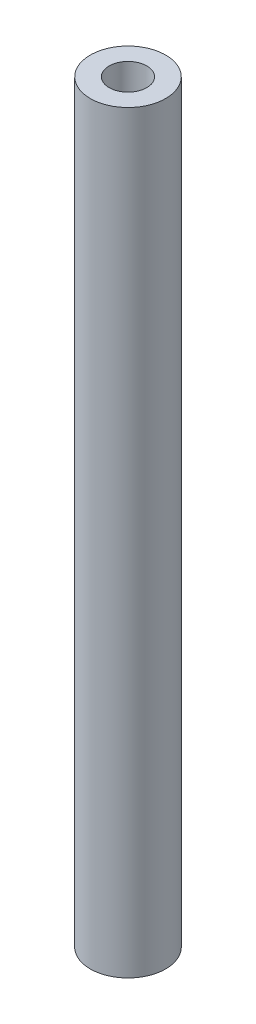
ISO-10303-21;
HEADER;
FILE_DESCRIPTION(('STEP AP214'),'2;1');
FILE_NAME('part.step','',(''),(''),'','','');
FILE_SCHEMA(('AUTOMOTIVE_DESIGN { 1 0 10303 214 1 1 1 1 }'));
ENDSEC;
DATA;
#1=APPLICATION_CONTEXT('core data for automotive mechanical design processes');
#2=APPLICATION_PROTOCOL_DEFINITION('international standard','automotive_design',2000,#1);
#3=PRODUCT_CONTEXT('',#1,'mechanical');
#4=PRODUCT('Part','Part','',(#3));
#5=PRODUCT_RELATED_PRODUCT_CATEGORY('part','',(#4));
#6=PRODUCT_DEFINITION_FORMATION('','',#4);
#7=PRODUCT_DEFINITION_CONTEXT('part definition',#1,'design');
#8=PRODUCT_DEFINITION('design','',#6,#7);
#9=PRODUCT_DEFINITION_SHAPE('','',#8);
#10=(LENGTH_UNIT() NAMED_UNIT(*) SI_UNIT(.MILLI.,.METRE.));
#11=(NAMED_UNIT(*) PLANE_ANGLE_UNIT() SI_UNIT($,.RADIAN.));
#12=(NAMED_UNIT(*) SI_UNIT($,.STERADIAN.) SOLID_ANGLE_UNIT());
#13=UNCERTAINTY_MEASURE_WITH_UNIT(LENGTH_MEASURE(1.E-05),#10,'distance_accuracy_value','');
#14=(GEOMETRIC_REPRESENTATION_CONTEXT(3) GLOBAL_UNCERTAINTY_ASSIGNED_CONTEXT((#13)) GLOBAL_UNIT_ASSIGNED_CONTEXT((#10,
#11,#12)) REPRESENTATION_CONTEXT('',''));
#15=CARTESIAN_POINT('',(0.,0.,0.));
#16=DIRECTION('',(0.,0.,1.));
#17=DIRECTION('',(1.,0.,0.));
#18=AXIS2_PLACEMENT_3D('',#15,#16,#17);
#19=CARTESIAN_POINT('',(0.,50.,0.));
#20=DIRECTION('',(0.,-1.,0.));
#21=DIRECTION('',(0.,0.,-1.));
#22=AXIS2_PLACEMENT_3D('',#19,#20,#21);
#23=CYLINDRICAL_SURFACE('',#22,2.5);
#24=CARTESIAN_POINT('',(0.,50.,0.));
#25=DIRECTION('',(0.,1.,0.));
#26=DIRECTION('',(0.,0.,1.));
#27=AXIS2_PLACEMENT_3D('',#24,#25,#26);
#28=CIRCLE('',#27,2.5);
#29=CARTESIAN_POINT('',(0.,50.,2.5));
#30=VERTEX_POINT('',#29);
#31=EDGE_CURVE('E10',#30,#30,#28,.T.);
#32=ORIENTED_EDGE('',*,*,#31,.F.);
#33=EDGE_LOOP('',(#32));
#34=FACE_BOUND('',#33,.T.);
#35=CARTESIAN_POINT('',(0.,0.,0.));
#36=DIRECTION('',(0.,1.,0.));
#37=DIRECTION('',(0.,0.,1.));
#38=AXIS2_PLACEMENT_3D('',#35,#36,#37);
#39=CIRCLE('',#38,2.5);
#40=CARTESIAN_POINT('',(0.,0.,2.5));
#41=VERTEX_POINT('',#40);
#42=EDGE_CURVE('E33',#41,#41,#39,.T.);
#43=ORIENTED_EDGE('',*,*,#42,.T.);
#44=EDGE_LOOP('',(#43));
#45=FACE_BOUND('',#44,.T.);
#46=ADVANCED_FACE('F30',(#34,#45),#23,.T.);
#47=CARTESIAN_POINT('',(0.,50.,0.));
#48=DIRECTION('',(0.,1.,0.));
#49=DIRECTION('',(0.,0.,1.));
#50=AXIS2_PLACEMENT_3D('',#47,#48,#49);
#51=PLANE('',#50);
#52=CARTESIAN_POINT('',(0.,50.,0.));
#53=DIRECTION('',(0.,1.,0.));
#54=DIRECTION('',(0.,0.,1.));
#55=AXIS2_PLACEMENT_3D('',#52,#53,#54);
#56=CIRCLE('',#55,1.25);
#57=CARTESIAN_POINT('',(0.,50.,1.25));
#58=VERTEX_POINT('',#57);
#59=EDGE_CURVE('E42',#58,#58,#56,.T.);
#60=ORIENTED_EDGE('',*,*,#59,.F.);
#61=EDGE_LOOP('',(#60));
#62=FACE_BOUND('',#61,.T.);
#63=ORIENTED_EDGE('',*,*,#31,.T.);
#64=EDGE_LOOP('',(#63));
#65=FACE_BOUND('',#64,.T.);
#66=ADVANCED_FACE('F57',(#62,#65),#51,.T.);
#67=CARTESIAN_POINT('',(0.,0.,0.));
#68=DIRECTION('',(0.,1.,0.));
#69=DIRECTION('',(0.,0.,1.));
#70=AXIS2_PLACEMENT_3D('',#67,#68,#69);
#71=PLANE('',#70);
#72=CARTESIAN_POINT('',(0.,0.,0.));
#73=DIRECTION('',(0.,1.,0.));
#74=DIRECTION('',(0.,0.,1.));
#75=AXIS2_PLACEMENT_3D('',#72,#73,#74);
#76=CIRCLE('',#75,1.25);
#77=CARTESIAN_POINT('',(0.,0.,1.25));
#78=VERTEX_POINT('',#77);
#79=EDGE_CURVE('E40',#78,#78,#76,.T.);
#80=ORIENTED_EDGE('',*,*,#79,.T.);
#81=EDGE_LOOP('',(#80));
#82=FACE_BOUND('',#81,.T.);
#83=ORIENTED_EDGE('',*,*,#42,.F.);
#84=EDGE_LOOP('',(#83));
#85=FACE_BOUND('',#84,.T.);
#86=ADVANCED_FACE('F48',(#82,#85),#71,.F.);
#87=CARTESIAN_POINT('',(0.,0.,0.));
#88=DIRECTION('',(0.,1.,0.));
#89=DIRECTION('',(0.,0.,1.));
#90=AXIS2_PLACEMENT_3D('',#87,#88,#89);
#91=CYLINDRICAL_SURFACE('',#90,1.25);
#92=ORIENTED_EDGE('',*,*,#79,.F.);
#93=EDGE_LOOP('',(#92));
#94=FACE_BOUND('',#93,.T.);
#95=ORIENTED_EDGE('',*,*,#59,.T.);
#96=EDGE_LOOP('',(#95));
#97=FACE_BOUND('',#96,.T.);
#98=ADVANCED_FACE('F51',(#94,#97),#91,.F.);
#99=CLOSED_SHELL('',(#46,#66,#86,#98));
#100=MANIFOLD_SOLID_BREP('B2',#99);
#101=ADVANCED_BREP_SHAPE_REPRESENTATION('',(#18,#100),#14);
#102=SHAPE_DEFINITION_REPRESENTATION(#9,#101);
ENDSEC;
END-ISO-10303-21;
